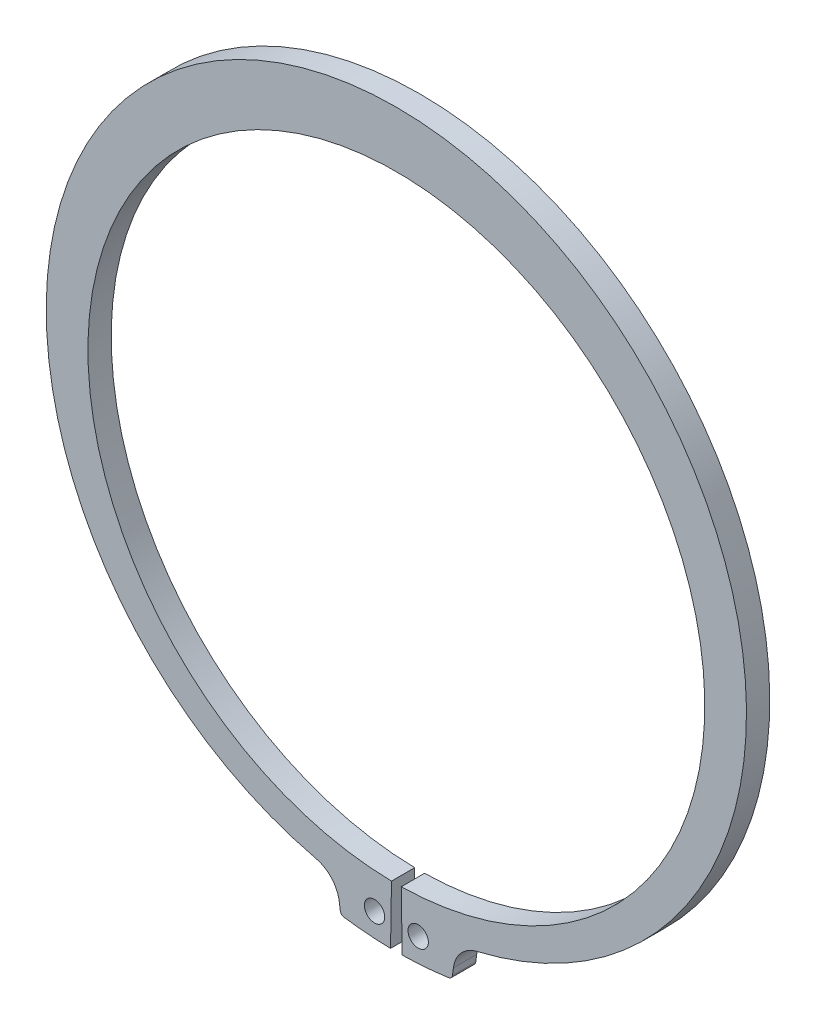
ISO-10303-21;
HEADER;
FILE_DESCRIPTION(('STEP AP214'),'2;1');
FILE_NAME('part.step','',(''),(''),'','','');
FILE_SCHEMA(('AUTOMOTIVE_DESIGN { 1 0 10303 214 1 1 1 1 }'));
ENDSEC;
DATA;
#1=APPLICATION_CONTEXT('core data for automotive mechanical design processes');
#2=APPLICATION_PROTOCOL_DEFINITION('international standard','automotive_design',2000,#1);
#3=PRODUCT_CONTEXT('',#1,'mechanical');
#4=PRODUCT('Part','Part','',(#3));
#5=PRODUCT_RELATED_PRODUCT_CATEGORY('part','',(#4));
#6=PRODUCT_DEFINITION_FORMATION('','',#4);
#7=PRODUCT_DEFINITION_CONTEXT('part definition',#1,'design');
#8=PRODUCT_DEFINITION('design','',#6,#7);
#9=PRODUCT_DEFINITION_SHAPE('','',#8);
#10=(LENGTH_UNIT() NAMED_UNIT(*) SI_UNIT(.MILLI.,.METRE.));
#11=(NAMED_UNIT(*) PLANE_ANGLE_UNIT() SI_UNIT($,.RADIAN.));
#12=(NAMED_UNIT(*) SI_UNIT($,.STERADIAN.) SOLID_ANGLE_UNIT());
#13=UNCERTAINTY_MEASURE_WITH_UNIT(LENGTH_MEASURE(1.E-05),#10,'distance_accuracy_value','');
#14=(GEOMETRIC_REPRESENTATION_CONTEXT(3) GLOBAL_UNCERTAINTY_ASSIGNED_CONTEXT((#13)) GLOBAL_UNIT_ASSIGNED_CONTEXT((#10,
#11,#12)) REPRESENTATION_CONTEXT('',''));
#15=CARTESIAN_POINT('',(0.,0.,0.));
#16=DIRECTION('',(0.,0.,1.));
#17=DIRECTION('',(1.,0.,0.));
#18=AXIS2_PLACEMENT_3D('',#15,#16,#17);
#19=CARTESIAN_POINT('',(0.,0.,-4.));
#20=DIRECTION('',(0.,0.,1.));
#21=DIRECTION('',(1.,0.,0.));
#22=AXIS2_PLACEMENT_3D('',#19,#20,#21);
#23=CYLINDRICAL_SURFACE('',#22,53.);
#24=CARTESIAN_POINT('',(0.,0.,0.));
#25=DIRECTION('',(0.,0.,-1.));
#26=DIRECTION('',(1.,0.,0.));
#27=AXIS2_PLACEMENT_3D('',#24,#25,#26);
#28=CIRCLE('',#27,53.);
#29=CARTESIAN_POINT('',(-0.839936608557845,-52.9933439829343,0.));
#30=VERTEX_POINT('',#29);
#31=CARTESIAN_POINT('',(0.839936608557845,-52.9933439829343,0.));
#32=VERTEX_POINT('',#31);
#33=EDGE_CURVE('E153',#30,#32,#28,.T.);
#34=ORIENTED_EDGE('',*,*,#33,.F.);
#35=DIRECTION('',(0.,0.,1.));
#36=VECTOR('',#35,1.);
#37=CARTESIAN_POINT('',(-0.839936608557845,-52.9933439829343,-4.));
#38=LINE('',#37,#36);
#39=CARTESIAN_POINT('',(-0.839936608557845,-52.9933439829343,-4.));
#40=VERTEX_POINT('',#39);
#41=EDGE_CURVE('E11',#40,#30,#38,.T.);
#42=ORIENTED_EDGE('',*,*,#41,.F.);
#43=CARTESIAN_POINT('',(0.,0.,-4.));
#44=DIRECTION('',(0.,0.,-1.));
#45=DIRECTION('',(1.,0.,0.));
#46=AXIS2_PLACEMENT_3D('',#43,#44,#45);
#47=CIRCLE('',#46,53.);
#48=CARTESIAN_POINT('',(0.839936608557845,-52.9933439829343,-4.));
#49=VERTEX_POINT('',#48);
#50=EDGE_CURVE('E186',#40,#49,#47,.T.);
#51=ORIENTED_EDGE('',*,*,#50,.T.);
#52=DIRECTION('',(0.,0.,1.));
#53=VECTOR('',#52,1.);
#54=CARTESIAN_POINT('',(0.839936608557845,-52.9933439829343,-4.));
#55=LINE('',#54,#53);
#56=EDGE_CURVE('E35',#49,#32,#55,.T.);
#57=ORIENTED_EDGE('',*,*,#56,.T.);
#58=EDGE_LOOP('',(#34,#42,#51,#57));
#59=FACE_BOUND('',#58,.T.);
#60=ADVANCED_FACE('F32',(#59),#23,.F.);
#61=CARTESIAN_POINT('',(-0.839936608557845,-52.9933439829343,-4.));
#62=DIRECTION('',(0.999874414772346,-0.0158478605388272,0.));
#63=DIRECTION('',(0.0158478605388273,0.999874414772346,0.));
#64=AXIS2_PLACEMENT_3D('',#61,#62,#63);
#65=PLANE('',#64);
#66=DIRECTION('',(0.0158478605388272,0.999874414772346,0.));
#67=VECTOR('',#66,1.);
#68=CARTESIAN_POINT('',(-0.839936608557845,-52.9933439829343,0.));
#69=LINE('',#68,#67);
#70=CARTESIAN_POINT('',(-1.,-63.0920755721351,0.));
#71=VERTEX_POINT('',#70);
#72=EDGE_CURVE('E184',#71,#30,#69,.T.);
#73=ORIENTED_EDGE('',*,*,#72,.F.);
#74=DIRECTION('',(0.,0.,1.));
#75=VECTOR('',#74,1.);
#76=CARTESIAN_POINT('',(-1.,-63.0920755721351,-4.));
#77=LINE('',#76,#75);
#78=CARTESIAN_POINT('',(-1.,-63.0920755721351,-4.));
#79=VERTEX_POINT('',#78);
#80=EDGE_CURVE('E41',#79,#71,#77,.T.);
#81=ORIENTED_EDGE('',*,*,#80,.F.);
#82=DIRECTION('',(0.0158478605388272,0.999874414772346,0.));
#83=VECTOR('',#82,1.);
#84=CARTESIAN_POINT('',(-0.839936608557845,-52.9933439829343,-4.));
#85=LINE('',#84,#83);
#86=EDGE_CURVE('E143',#79,#40,#85,.T.);
#87=ORIENTED_EDGE('',*,*,#86,.T.);
#88=ORIENTED_EDGE('',*,*,#41,.T.);
#89=EDGE_LOOP('',(#73,#81,#87,#88));
#90=FACE_BOUND('',#89,.T.);
#91=ADVANCED_FACE('F206',(#90),#65,.T.);
#92=CARTESIAN_POINT('',(0.,0.,-4.));
#93=DIRECTION('',(0.,0.,1.));
#94=DIRECTION('',(1.,0.,0.));
#95=AXIS2_PLACEMENT_3D('',#92,#93,#94);
#96=CYLINDRICAL_SURFACE('',#95,63.1);
#97=CARTESIAN_POINT('',(0.,0.,0.));
#98=DIRECTION('',(0.,0.,1.));
#99=DIRECTION('',(1.,0.,0.));
#100=AXIS2_PLACEMENT_3D('',#97,#98,#99);
#101=CIRCLE('',#100,63.1);
#102=CARTESIAN_POINT('',(-9.00139974067277,-62.4546619773786,0.));
#103=VERTEX_POINT('',#102);
#104=EDGE_CURVE('E130',#103,#71,#101,.T.);
#105=ORIENTED_EDGE('',*,*,#104,.F.);
#106=DIRECTION('',(0.,0.,1.));
#107=VECTOR('',#106,1.);
#108=CARTESIAN_POINT('',(-9.00139974067277,-62.4546619773786,-4.));
#109=LINE('',#108,#107);
#110=CARTESIAN_POINT('',(-9.00139974067277,-62.4546619773786,-4.));
#111=VERTEX_POINT('',#110);
#112=EDGE_CURVE('E125',#111,#103,#109,.T.);
#113=ORIENTED_EDGE('',*,*,#112,.F.);
#114=CARTESIAN_POINT('',(0.,0.,-4.));
#115=DIRECTION('',(0.,0.,1.));
#116=DIRECTION('',(1.,0.,0.));
#117=AXIS2_PLACEMENT_3D('',#114,#115,#116);
#118=CIRCLE('',#117,63.1);
#119=EDGE_CURVE('E128',#111,#79,#118,.T.);
#120=ORIENTED_EDGE('',*,*,#119,.T.);
#121=ORIENTED_EDGE('',*,*,#80,.T.);
#122=EDGE_LOOP('',(#105,#113,#120,#121));
#123=FACE_BOUND('',#122,.T.);
#124=ADVANCED_FACE('F127',(#123),#96,.T.);
#125=CARTESIAN_POINT('',(-8.89441004486441,-61.7123323976157,-4.));
#126=DIRECTION('',(0.,0.,1.));
#127=DIRECTION('',(1.,0.,0.));
#128=AXIS2_PLACEMENT_3D('',#125,#126,#127);
#129=CYLINDRICAL_SURFACE('',#128,0.750000000000012);
#130=CARTESIAN_POINT('',(-8.89441004486441,-61.7123323976157,0.));
#131=DIRECTION('',(0.,0.,1.));
#132=DIRECTION('',(1.,0.,0.));
#133=AXIS2_PLACEMENT_3D('',#130,#131,#132);
#134=CIRCLE('',#133,0.750000000000012);
#135=CARTESIAN_POINT('',(-9.63799369089478,-61.8102270417808,0.));
#136=VERTEX_POINT('',#135);
#137=EDGE_CURVE('E181',#136,#103,#134,.T.);
#138=ORIENTED_EDGE('',*,*,#137,.F.);
#139=DIRECTION('',(0.,0.,1.));
#140=VECTOR('',#139,1.);
#141=CARTESIAN_POINT('',(-9.63799369089478,-61.8102270417808,-4.));
#142=LINE('',#141,#140);
#143=CARTESIAN_POINT('',(-9.63799369089478,-61.8102270417808,-4.));
#144=VERTEX_POINT('',#143);
#145=EDGE_CURVE('E135',#144,#136,#142,.T.);
#146=ORIENTED_EDGE('',*,*,#145,.F.);
#147=CARTESIAN_POINT('',(-8.89441004486441,-61.7123323976157,-4.));
#148=DIRECTION('',(0.,0.,1.));
#149=DIRECTION('',(1.,0.,0.));
#150=AXIS2_PLACEMENT_3D('',#147,#148,#149);
#151=CIRCLE('',#150,0.750000000000012);
#152=EDGE_CURVE('E141',#144,#111,#151,.T.);
#153=ORIENTED_EDGE('',*,*,#152,.T.);
#154=ORIENTED_EDGE('',*,*,#112,.T.);
#155=EDGE_LOOP('',(#138,#146,#153,#154));
#156=FACE_BOUND('',#155,.T.);
#157=ADVANCED_FACE('F145',(#156),#129,.T.);
#158=CARTESIAN_POINT('',(-9.79912696380666,-60.5862983213634,-4.));
#159=DIRECTION('',(-0.991444861373812,-0.13052619222004,0.));
#160=DIRECTION('',(0.13052619222004,-0.991444861373812,0.));
#161=AXIS2_PLACEMENT_3D('',#158,#159,#160);
#162=PLANE('',#161);
#163=DIRECTION('',(0.13052619222004,-0.991444861373812,0.));
#164=VECTOR('',#163,1.);
#165=CARTESIAN_POINT('',(-9.79912696380666,-60.5862983213634,0.));
#166=LINE('',#165,#164);
#167=CARTESIAN_POINT('',(-9.79912696380666,-60.5862983213634,0.));
#168=VERTEX_POINT('',#167);
#169=EDGE_CURVE('E178',#168,#136,#166,.T.);
#170=ORIENTED_EDGE('',*,*,#169,.F.);
#171=DIRECTION('',(0.,0.,1.));
#172=VECTOR('',#171,1.);
#173=CARTESIAN_POINT('',(-9.79912696380666,-60.5862983213634,-4.));
#174=LINE('',#173,#172);
#175=CARTESIAN_POINT('',(-9.79912696380666,-60.5862983213634,-4.));
#176=VERTEX_POINT('',#175);
#177=EDGE_CURVE('E190',#176,#168,#174,.T.);
#178=ORIENTED_EDGE('',*,*,#177,.F.);
#179=DIRECTION('',(0.13052619222004,-0.991444861373812,0.));
#180=VECTOR('',#179,1.);
#181=CARTESIAN_POINT('',(-9.79912696380666,-60.5862983213634,-4.));
#182=LINE('',#181,#180);
#183=EDGE_CURVE('E146',#176,#144,#182,.T.);
#184=ORIENTED_EDGE('',*,*,#183,.T.);
#185=ORIENTED_EDGE('',*,*,#145,.T.);
#186=EDGE_LOOP('',(#170,#178,#184,#185));
#187=FACE_BOUND('',#186,.T.);
#188=ADVANCED_FACE('F219',(#187),#162,.T.);
#189=CARTESIAN_POINT('',(-15.0535598645609,-61.278057536153,-4.));
#190=DIRECTION('',(0.,0.,1.));
#191=DIRECTION('',(1.,0.,0.));
#192=AXIS2_PLACEMENT_3D('',#189,#190,#191);
#193=CYLINDRICAL_SURFACE('',#192,5.29977319512588);
#194=CARTESIAN_POINT('',(-15.0535598645609,-61.278057536153,0.));
#195=DIRECTION('',(0.,0.,-1.));
#196=DIRECTION('',(1.,0.,0.));
#197=AXIS2_PLACEMENT_3D('',#194,#195,#196);
#198=CIRCLE('',#197,5.29977319512588);
#199=CARTESIAN_POINT('',(-13.8349058084058,-56.1202985061875,0.));
#200=VERTEX_POINT('',#199);
#201=EDGE_CURVE('E175',#200,#168,#198,.T.);
#202=ORIENTED_EDGE('',*,*,#201,.F.);
#203=DIRECTION('',(0.,0.,1.));
#204=VECTOR('',#203,1.);
#205=CARTESIAN_POINT('',(-13.8349058084058,-56.1202985061875,-4.));
#206=LINE('',#205,#204);
#207=CARTESIAN_POINT('',(-13.8349058084058,-56.1202985061875,-4.));
#208=VERTEX_POINT('',#207);
#209=EDGE_CURVE('E192',#208,#200,#206,.T.);
#210=ORIENTED_EDGE('',*,*,#209,.F.);
#211=CARTESIAN_POINT('',(-15.0535598645609,-61.278057536153,-4.));
#212=DIRECTION('',(0.,0.,-1.));
#213=DIRECTION('',(1.,0.,0.));
#214=AXIS2_PLACEMENT_3D('',#211,#212,#213);
#215=CIRCLE('',#214,5.29977319512588);
#216=EDGE_CURVE('E148',#208,#176,#215,.T.);
#217=ORIENTED_EDGE('',*,*,#216,.T.);
#218=ORIENTED_EDGE('',*,*,#177,.T.);
#219=EDGE_LOOP('',(#202,#210,#217,#218));
#220=FACE_BOUND('',#219,.T.);
#221=ADVANCED_FACE('F222',(#220),#193,.F.);
#222=CARTESIAN_POINT('',(0.,2.43373493884382,-4.));
#223=DIRECTION('',(0.,0.,1.));
#224=DIRECTION('',(1.,0.,0.));
#225=AXIS2_PLACEMENT_3D('',#222,#223,#224);
#226=CYLINDRICAL_SURFACE('',#225,60.1662650611562);
#227=CARTESIAN_POINT('',(0.,2.43373493884382,0.));
#228=DIRECTION('',(0.,0.,1.));
#229=DIRECTION('',(1.,0.,0.));
#230=AXIS2_PLACEMENT_3D('',#227,#228,#229);
#231=CIRCLE('',#230,60.1662650611562);
#232=CARTESIAN_POINT('',(13.8349058084058,-56.1202985061875,0.));
#233=VERTEX_POINT('',#232);
#234=EDGE_CURVE('E172',#233,#200,#231,.T.);
#235=ORIENTED_EDGE('',*,*,#234,.F.);
#236=DIRECTION('',(0.,0.,1.));
#237=VECTOR('',#236,1.);
#238=CARTESIAN_POINT('',(13.8349058084058,-56.1202985061875,-4.));
#239=LINE('',#238,#237);
#240=CARTESIAN_POINT('',(13.8349058084058,-56.1202985061875,-4.));
#241=VERTEX_POINT('',#240);
#242=EDGE_CURVE('E194',#241,#233,#239,.T.);
#243=ORIENTED_EDGE('',*,*,#242,.F.);
#244=CARTESIAN_POINT('',(0.,2.43373493884382,-4.));
#245=DIRECTION('',(0.,0.,1.));
#246=DIRECTION('',(1.,0.,0.));
#247=AXIS2_PLACEMENT_3D('',#244,#245,#246);
#248=CIRCLE('',#247,60.1662650611562);
#249=EDGE_CURVE('E296',#241,#208,#248,.T.);
#250=ORIENTED_EDGE('',*,*,#249,.T.);
#251=ORIENTED_EDGE('',*,*,#209,.T.);
#252=EDGE_LOOP('',(#235,#243,#250,#251));
#253=FACE_BOUND('',#252,.T.);
#254=ADVANCED_FACE('F226',(#253),#226,.T.);
#255=CARTESIAN_POINT('',(15.0535598645609,-61.278057536153,-4.));
#256=DIRECTION('',(0.,0.,1.));
#257=DIRECTION('',(1.,0.,0.));
#258=AXIS2_PLACEMENT_3D('',#255,#256,#257);
#259=CYLINDRICAL_SURFACE('',#258,5.29977319512587);
#260=CARTESIAN_POINT('',(15.0535598645609,-61.278057536153,0.));
#261=DIRECTION('',(0.,0.,-1.));
#262=DIRECTION('',(1.,0.,0.));
#263=AXIS2_PLACEMENT_3D('',#260,#261,#262);
#264=CIRCLE('',#263,5.29977319512587);
#265=CARTESIAN_POINT('',(9.79912696380667,-60.5862983213634,0.));
#266=VERTEX_POINT('',#265);
#267=EDGE_CURVE('E169',#266,#233,#264,.T.);
#268=ORIENTED_EDGE('',*,*,#267,.F.);
#269=DIRECTION('',(0.,0.,1.));
#270=VECTOR('',#269,1.);
#271=CARTESIAN_POINT('',(9.79912696380667,-60.5862983213634,-4.));
#272=LINE('',#271,#270);
#273=CARTESIAN_POINT('',(9.79912696380667,-60.5862983213634,-4.));
#274=VERTEX_POINT('',#273);
#275=EDGE_CURVE('E196',#274,#266,#272,.T.);
#276=ORIENTED_EDGE('',*,*,#275,.F.);
#277=CARTESIAN_POINT('',(15.0535598645609,-61.278057536153,-4.));
#278=DIRECTION('',(0.,0.,-1.));
#279=DIRECTION('',(1.,0.,0.));
#280=AXIS2_PLACEMENT_3D('',#277,#278,#279);
#281=CIRCLE('',#280,5.29977319512587);
#282=EDGE_CURVE('E293',#274,#241,#281,.T.);
#283=ORIENTED_EDGE('',*,*,#282,.T.);
#284=ORIENTED_EDGE('',*,*,#242,.T.);
#285=EDGE_LOOP('',(#268,#276,#283,#284));
#286=FACE_BOUND('',#285,.T.);
#287=ADVANCED_FACE('F230',(#286),#259,.F.);
#288=CARTESIAN_POINT('',(9.79912696380667,-60.5862983213634,-4.));
#289=DIRECTION('',(0.991444861373811,-0.130526192220049,0.));
#290=DIRECTION('',(0.130526192220049,0.991444861373811,0.));
#291=AXIS2_PLACEMENT_3D('',#288,#289,#290);
#292=PLANE('',#291);
#293=DIRECTION('',(0.130526192220049,0.991444861373811,0.));
#294=VECTOR('',#293,1.);
#295=CARTESIAN_POINT('',(9.79912696380667,-60.5862983213634,0.));
#296=LINE('',#295,#294);
#297=CARTESIAN_POINT('',(9.63799369089477,-61.8102270417808,0.));
#298=VERTEX_POINT('',#297);
#299=EDGE_CURVE('E166',#298,#266,#296,.T.);
#300=ORIENTED_EDGE('',*,*,#299,.F.);
#301=DIRECTION('',(0.,0.,1.));
#302=VECTOR('',#301,1.);
#303=CARTESIAN_POINT('',(9.63799369089477,-61.8102270417808,-4.));
#304=LINE('',#303,#302);
#305=CARTESIAN_POINT('',(9.63799369089477,-61.8102270417808,-4.));
#306=VERTEX_POINT('',#305);
#307=EDGE_CURVE('E198',#306,#298,#304,.T.);
#308=ORIENTED_EDGE('',*,*,#307,.F.);
#309=DIRECTION('',(0.130526192220049,0.991444861373811,0.));
#310=VECTOR('',#309,1.);
#311=CARTESIAN_POINT('',(9.79912696380667,-60.5862983213634,-4.));
#312=LINE('',#311,#310);
#313=EDGE_CURVE('E290',#306,#274,#312,.T.);
#314=ORIENTED_EDGE('',*,*,#313,.T.);
#315=ORIENTED_EDGE('',*,*,#275,.T.);
#316=EDGE_LOOP('',(#300,#308,#314,#315));
#317=FACE_BOUND('',#316,.T.);
#318=ADVANCED_FACE('F234',(#317),#292,.T.);
#319=CARTESIAN_POINT('',(8.89441004486441,-61.7123323976157,-4.));
#320=DIRECTION('',(0.,0.,1.));
#321=DIRECTION('',(1.,0.,0.));
#322=AXIS2_PLACEMENT_3D('',#319,#320,#321);
#323=CYLINDRICAL_SURFACE('',#322,0.750000000000012);
#324=CARTESIAN_POINT('',(8.89441004486441,-61.7123323976157,0.));
#325=DIRECTION('',(0.,0.,1.));
#326=DIRECTION('',(-1.,0.,0.));
#327=AXIS2_PLACEMENT_3D('',#324,#325,#326);
#328=CIRCLE('',#327,0.750000000000012);
#329=CARTESIAN_POINT('',(9.00139974067272,-62.4546619773786,0.));
#330=VERTEX_POINT('',#329);
#331=EDGE_CURVE('E163',#330,#298,#328,.T.);
#332=ORIENTED_EDGE('',*,*,#331,.F.);
#333=DIRECTION('',(0.,0.,1.));
#334=VECTOR('',#333,1.);
#335=CARTESIAN_POINT('',(9.00139974067272,-62.4546619773786,-4.));
#336=LINE('',#335,#334);
#337=CARTESIAN_POINT('',(9.00139974067272,-62.4546619773786,-4.));
#338=VERTEX_POINT('',#337);
#339=EDGE_CURVE('E200',#338,#330,#336,.T.);
#340=ORIENTED_EDGE('',*,*,#339,.F.);
#341=CARTESIAN_POINT('',(8.89441004486441,-61.7123323976157,-4.));
#342=DIRECTION('',(0.,0.,1.));
#343=DIRECTION('',(-1.,0.,0.));
#344=AXIS2_PLACEMENT_3D('',#341,#342,#343);
#345=CIRCLE('',#344,0.750000000000012);
#346=EDGE_CURVE('E287',#338,#306,#345,.T.);
#347=ORIENTED_EDGE('',*,*,#346,.T.);
#348=ORIENTED_EDGE('',*,*,#307,.T.);
#349=EDGE_LOOP('',(#332,#340,#347,#348));
#350=FACE_BOUND('',#349,.T.);
#351=ADVANCED_FACE('F238',(#350),#323,.T.);
#352=CARTESIAN_POINT('',(0.,0.,-4.));
#353=DIRECTION('',(0.,0.,1.));
#354=DIRECTION('',(1.,0.,0.));
#355=AXIS2_PLACEMENT_3D('',#352,#353,#354);
#356=CYLINDRICAL_SURFACE('',#355,63.1);
#357=CARTESIAN_POINT('',(0.,0.,0.));
#358=DIRECTION('',(0.,0.,1.));
#359=DIRECTION('',(1.,0.,0.));
#360=AXIS2_PLACEMENT_3D('',#357,#358,#359);
#361=CIRCLE('',#360,63.1);
#362=CARTESIAN_POINT('',(0.999999999999989,-63.0920755721351,0.));
#363=VERTEX_POINT('',#362);
#364=EDGE_CURVE('E160',#363,#330,#361,.T.);
#365=ORIENTED_EDGE('',*,*,#364,.F.);
#366=DIRECTION('',(0.,0.,1.));
#367=VECTOR('',#366,1.);
#368=CARTESIAN_POINT('',(0.999999999999989,-63.0920755721351,-4.));
#369=LINE('',#368,#367);
#370=CARTESIAN_POINT('',(0.999999999999989,-63.0920755721351,-4.));
#371=VERTEX_POINT('',#370);
#372=EDGE_CURVE('E201',#371,#363,#369,.T.);
#373=ORIENTED_EDGE('',*,*,#372,.F.);
#374=CARTESIAN_POINT('',(0.,0.,-4.));
#375=DIRECTION('',(0.,0.,1.));
#376=DIRECTION('',(1.,0.,0.));
#377=AXIS2_PLACEMENT_3D('',#374,#375,#376);
#378=CIRCLE('',#377,63.1);
#379=EDGE_CURVE('E284',#371,#338,#378,.T.);
#380=ORIENTED_EDGE('',*,*,#379,.T.);
#381=ORIENTED_EDGE('',*,*,#339,.T.);
#382=EDGE_LOOP('',(#365,#373,#380,#381));
#383=FACE_BOUND('',#382,.T.);
#384=ADVANCED_FACE('F242',(#383),#356,.T.);
#385=CARTESIAN_POINT('',(0.839936608557845,-52.9933439829343,-4.));
#386=DIRECTION('',(-0.999874414772346,-0.0158478605388272,0.));
#387=DIRECTION('',(0.0158478605388273,-0.999874414772346,0.));
#388=AXIS2_PLACEMENT_3D('',#385,#386,#387);
#389=PLANE('',#388);
#390=DIRECTION('',(0.0158478605388272,-0.999874414772346,0.));
#391=VECTOR('',#390,1.);
#392=CARTESIAN_POINT('',(0.839936608557845,-52.9933439829343,0.));
#393=LINE('',#392,#391);
#394=EDGE_CURVE('E156',#32,#363,#393,.T.);
#395=ORIENTED_EDGE('',*,*,#394,.F.);
#396=ORIENTED_EDGE('',*,*,#56,.F.);
#397=DIRECTION('',(0.0158478605388272,-0.999874414772346,0.));
#398=VECTOR('',#397,1.);
#399=CARTESIAN_POINT('',(0.839936608557845,-52.9933439829343,-4.));
#400=LINE('',#399,#398);
#401=EDGE_CURVE('E282',#49,#371,#400,.T.);
#402=ORIENTED_EDGE('',*,*,#401,.T.);
#403=ORIENTED_EDGE('',*,*,#372,.T.);
#404=EDGE_LOOP('',(#395,#396,#402,#403));
#405=FACE_BOUND('',#404,.T.);
#406=ADVANCED_FACE('F203',(#405),#389,.T.);
#407=CARTESIAN_POINT('',(0.,0.,-4.));
#408=DIRECTION('',(0.,0.,1.));
#409=DIRECTION('',(1.,0.,0.));
#410=AXIS2_PLACEMENT_3D('',#407,#408,#409);
#411=PLANE('',#410);
#412=CARTESIAN_POINT('',(-3.75,-58.9308068840059,-4.));
#413=DIRECTION('',(0.,0.,1.));
#414=DIRECTION('',(1.,0.,0.));
#415=AXIS2_PLACEMENT_3D('',#412,#413,#414);
#416=CIRCLE('',#415,1.75);
#417=CARTESIAN_POINT('',(-2.,-58.9308068840059,-4.));
#418=VERTEX_POINT('',#417);
#419=EDGE_CURVE('E269',#418,#418,#416,.T.);
#420=ORIENTED_EDGE('',*,*,#419,.T.);
#421=EDGE_LOOP('',(#420));
#422=FACE_BOUND('',#421,.T.);
#423=CARTESIAN_POINT('',(3.75,-58.9308068840059,-4.));
#424=DIRECTION('',(0.,0.,1.));
#425=DIRECTION('',(1.,0.,0.));
#426=AXIS2_PLACEMENT_3D('',#423,#424,#425);
#427=CIRCLE('',#426,1.75);
#428=CARTESIAN_POINT('',(5.5,-58.9308068840059,-4.));
#429=VERTEX_POINT('',#428);
#430=EDGE_CURVE('E157',#429,#429,#427,.T.);
#431=ORIENTED_EDGE('',*,*,#430,.T.);
#432=EDGE_LOOP('',(#431));
#433=FACE_BOUND('',#432,.T.);
#434=ORIENTED_EDGE('',*,*,#50,.F.);
#435=ORIENTED_EDGE('',*,*,#86,.F.);
#436=ORIENTED_EDGE('',*,*,#119,.F.);
#437=ORIENTED_EDGE('',*,*,#152,.F.);
#438=ORIENTED_EDGE('',*,*,#183,.F.);
#439=ORIENTED_EDGE('',*,*,#216,.F.);
#440=ORIENTED_EDGE('',*,*,#249,.F.);
#441=ORIENTED_EDGE('',*,*,#282,.F.);
#442=ORIENTED_EDGE('',*,*,#313,.F.);
#443=ORIENTED_EDGE('',*,*,#346,.F.);
#444=ORIENTED_EDGE('',*,*,#379,.F.);
#445=ORIENTED_EDGE('',*,*,#401,.F.);
#446=EDGE_LOOP('',(#434,#435,#436,#437,#438,#439,#440,#441,#442,#443,#444,#445));
#447=FACE_BOUND('',#446,.T.);
#448=ADVANCED_FACE('F139',(#422,#433,#447),#411,.F.);
#449=CARTESIAN_POINT('',(0.,0.,0.));
#450=DIRECTION('',(0.,0.,1.));
#451=DIRECTION('',(1.,0.,0.));
#452=AXIS2_PLACEMENT_3D('',#449,#450,#451);
#453=PLANE('',#452);
#454=CARTESIAN_POINT('',(-3.75,-58.9308068840059,0.));
#455=DIRECTION('',(0.,0.,1.));
#456=DIRECTION('',(1.,0.,0.));
#457=AXIS2_PLACEMENT_3D('',#454,#455,#456);
#458=CIRCLE('',#457,1.75);
#459=CARTESIAN_POINT('',(-2.,-58.9308068840059,0.));
#460=VERTEX_POINT('',#459);
#461=EDGE_CURVE('E272',#460,#460,#458,.T.);
#462=ORIENTED_EDGE('',*,*,#461,.F.);
#463=EDGE_LOOP('',(#462));
#464=FACE_BOUND('',#463,.T.);
#465=CARTESIAN_POINT('',(3.75,-58.9308068840059,0.));
#466=DIRECTION('',(0.,0.,1.));
#467=DIRECTION('',(1.,0.,0.));
#468=AXIS2_PLACEMENT_3D('',#465,#466,#467);
#469=CIRCLE('',#468,1.75);
#470=CARTESIAN_POINT('',(5.5,-58.9308068840059,0.));
#471=VERTEX_POINT('',#470);
#472=EDGE_CURVE('E274',#471,#471,#469,.T.);
#473=ORIENTED_EDGE('',*,*,#472,.F.);
#474=EDGE_LOOP('',(#473));
#475=FACE_BOUND('',#474,.T.);
#476=ORIENTED_EDGE('',*,*,#33,.T.);
#477=ORIENTED_EDGE('',*,*,#394,.T.);
#478=ORIENTED_EDGE('',*,*,#364,.T.);
#479=ORIENTED_EDGE('',*,*,#331,.T.);
#480=ORIENTED_EDGE('',*,*,#299,.T.);
#481=ORIENTED_EDGE('',*,*,#267,.T.);
#482=ORIENTED_EDGE('',*,*,#234,.T.);
#483=ORIENTED_EDGE('',*,*,#201,.T.);
#484=ORIENTED_EDGE('',*,*,#169,.T.);
#485=ORIENTED_EDGE('',*,*,#137,.T.);
#486=ORIENTED_EDGE('',*,*,#104,.T.);
#487=ORIENTED_EDGE('',*,*,#72,.T.);
#488=EDGE_LOOP('',(#476,#477,#478,#479,#480,#481,#482,#483,#484,#485,#486,#487));
#489=FACE_BOUND('',#488,.T.);
#490=ADVANCED_FACE('F205',(#464,#475,#489),#453,.T.);
#491=CARTESIAN_POINT('',(3.75,-58.9308068840059,-4.));
#492=DIRECTION('',(0.,0.,1.));
#493=DIRECTION('',(1.,0.,0.));
#494=AXIS2_PLACEMENT_3D('',#491,#492,#493);
#495=CYLINDRICAL_SURFACE('',#494,1.75);
#496=ORIENTED_EDGE('',*,*,#430,.F.);
#497=EDGE_LOOP('',(#496));
#498=FACE_BOUND('',#497,.T.);
#499=ORIENTED_EDGE('',*,*,#472,.T.);
#500=EDGE_LOOP('',(#499));
#501=FACE_BOUND('',#500,.T.);
#502=ADVANCED_FACE('F254',(#498,#501),#495,.F.);
#503=CARTESIAN_POINT('',(-3.75,-58.9308068840059,-4.));
#504=DIRECTION('',(0.,0.,1.));
#505=DIRECTION('',(1.,0.,0.));
#506=AXIS2_PLACEMENT_3D('',#503,#504,#505);
#507=CYLINDRICAL_SURFACE('',#506,1.75);
#508=ORIENTED_EDGE('',*,*,#419,.F.);
#509=EDGE_LOOP('',(#508));
#510=FACE_BOUND('',#509,.T.);
#511=ORIENTED_EDGE('',*,*,#461,.T.);
#512=EDGE_LOOP('',(#511));
#513=FACE_BOUND('',#512,.T.);
#514=ADVANCED_FACE('F261',(#510,#513),#507,.F.);
#515=CLOSED_SHELL('',(#60,#91,#124,#157,#188,#221,#254,#287,#318,#351,#384,#406,#448,#490,#502,#514));
#516=MANIFOLD_SOLID_BREP('B2',#515);
#517=ADVANCED_BREP_SHAPE_REPRESENTATION('',(#18,#516),#14);
#518=SHAPE_DEFINITION_REPRESENTATION(#9,#517);
ENDSEC;
END-ISO-10303-21;
